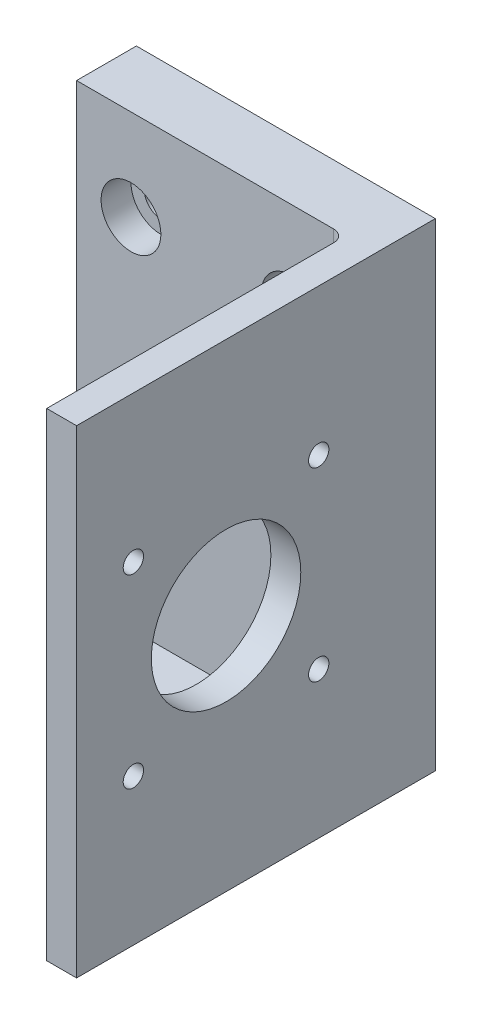
ISO-10303-21;
HEADER;
FILE_DESCRIPTION(('STEP AP214'),'2;1');
FILE_NAME('part.step','',(''),(''),'','','');
FILE_SCHEMA(('AUTOMOTIVE_DESIGN { 1 0 10303 214 1 1 1 1 }'));
ENDSEC;
DATA;
#1=APPLICATION_CONTEXT('core data for automotive mechanical design processes');
#2=APPLICATION_PROTOCOL_DEFINITION('international standard','automotive_design',2000,#1);
#3=PRODUCT_CONTEXT('',#1,'mechanical');
#4=PRODUCT('Part','Part','',(#3));
#5=PRODUCT_RELATED_PRODUCT_CATEGORY('part','',(#4));
#6=PRODUCT_DEFINITION_FORMATION('','',#4);
#7=PRODUCT_DEFINITION_CONTEXT('part definition',#1,'design');
#8=PRODUCT_DEFINITION('design','',#6,#7);
#9=PRODUCT_DEFINITION_SHAPE('','',#8);
#10=(LENGTH_UNIT() NAMED_UNIT(*) SI_UNIT(.MILLI.,.METRE.));
#11=(NAMED_UNIT(*) PLANE_ANGLE_UNIT() SI_UNIT($,.RADIAN.));
#12=(NAMED_UNIT(*) SI_UNIT($,.STERADIAN.) SOLID_ANGLE_UNIT());
#13=UNCERTAINTY_MEASURE_WITH_UNIT(LENGTH_MEASURE(1.E-05),#10,'distance_accuracy_value','');
#14=(GEOMETRIC_REPRESENTATION_CONTEXT(3) GLOBAL_UNCERTAINTY_ASSIGNED_CONTEXT((#13)) GLOBAL_UNIT_ASSIGNED_CONTEXT((#10,
#11,#12)) REPRESENTATION_CONTEXT('',''));
#15=CARTESIAN_POINT('',(0.,0.,0.));
#16=DIRECTION('',(0.,0.,1.));
#17=DIRECTION('',(1.,0.,0.));
#18=AXIS2_PLACEMENT_3D('',#15,#16,#17);
#19=CARTESIAN_POINT('',(0.,0.,10.));
#20=DIRECTION('',(0.,0.,1.));
#21=DIRECTION('',(1.,0.,0.));
#22=AXIS2_PLACEMENT_3D('',#19,#20,#21);
#23=PLANE('',#22);
#24=CARTESIAN_POINT('',(10.9029313913286,24.76,10.));
#25=DIRECTION('',(0.,0.,1.));
#26=DIRECTION('',(1.,0.,0.));
#27=AXIS2_PLACEMENT_3D('',#24,#25,#26);
#28=CIRCLE('',#27,5.);
#29=CARTESIAN_POINT('',(15.9029313913286,24.76,10.));
#30=VERTEX_POINT('',#29);
#31=EDGE_CURVE('E267',#30,#30,#28,.T.);
#32=ORIENTED_EDGE('',*,*,#31,.F.);
#33=EDGE_LOOP('',(#32));
#34=FACE_BOUND('',#33,.T.);
#35=CARTESIAN_POINT('',(-15.9029313913286,-24.76,10.));
#36=DIRECTION('',(0.,0.,1.));
#37=DIRECTION('',(1.,0.,0.));
#38=AXIS2_PLACEMENT_3D('',#35,#36,#37);
#39=CIRCLE('',#38,5.);
#40=CARTESIAN_POINT('',(-10.9029313913286,-24.76,10.));
#41=VERTEX_POINT('',#40);
#42=EDGE_CURVE('E284',#41,#41,#39,.T.);
#43=ORIENTED_EDGE('',*,*,#42,.F.);
#44=EDGE_LOOP('',(#43));
#45=FACE_BOUND('',#44,.T.);
#46=CARTESIAN_POINT('',(10.9029313913286,-24.76,10.));
#47=DIRECTION('',(0.,0.,1.));
#48=DIRECTION('',(1.,0.,0.));
#49=AXIS2_PLACEMENT_3D('',#46,#47,#48);
#50=CIRCLE('',#49,5.);
#51=CARTESIAN_POINT('',(15.9029313913286,-24.76,10.));
#52=VERTEX_POINT('',#51);
#53=EDGE_CURVE('E300',#52,#52,#50,.T.);
#54=ORIENTED_EDGE('',*,*,#53,.F.);
#55=EDGE_LOOP('',(#54));
#56=FACE_BOUND('',#55,.T.);
#57=CARTESIAN_POINT('',(-15.9029313913286,24.76,10.));
#58=DIRECTION('',(0.,0.,1.));
#59=DIRECTION('',(1.,0.,0.));
#60=AXIS2_PLACEMENT_3D('',#57,#58,#59);
#61=CIRCLE('',#60,5.);
#62=CARTESIAN_POINT('',(-10.9029313913286,24.76,10.));
#63=VERTEX_POINT('',#62);
#64=EDGE_CURVE('E316',#63,#63,#61,.T.);
#65=ORIENTED_EDGE('',*,*,#64,.F.);
#66=EDGE_LOOP('',(#65));
#67=FACE_BOUND('',#66,.T.);
#68=DIRECTION('',(0.,-1.,0.));
#69=VECTOR('',#68,1.);
#70=CARTESIAN_POINT('',(-25.,-40.,10.));
#71=LINE('',#70,#69);
#72=CARTESIAN_POINT('',(-25.,40.,10.));
#73=VERTEX_POINT('',#72);
#74=CARTESIAN_POINT('',(-25.,-34.92,10.));
#75=VERTEX_POINT('',#74);
#76=EDGE_CURVE('E162',#73,#75,#71,.T.);
#77=ORIENTED_EDGE('',*,*,#76,.T.);
#78=DIRECTION('',(1.,0.,0.));
#79=VECTOR('',#78,1.);
#80=CARTESIAN_POINT('',(-25.,-34.92,10.));
#81=LINE('',#80,#79);
#82=CARTESIAN_POINT('',(18.,-34.92,10.));
#83=VERTEX_POINT('',#82);
#84=EDGE_CURVE('E125',#75,#83,#81,.T.);
#85=ORIENTED_EDGE('',*,*,#84,.T.);
#86=DIRECTION('',(0.,-1.,0.));
#87=VECTOR('',#86,1.);
#88=CARTESIAN_POINT('',(18.,0.,10.));
#89=LINE('',#88,#87);
#90=CARTESIAN_POINT('',(18.,40.,10.));
#91=VERTEX_POINT('',#90);
#92=EDGE_CURVE('E63',#83,#91,#89,.F.);
#93=ORIENTED_EDGE('',*,*,#92,.T.);
#94=DIRECTION('',(-1.,0.,0.));
#95=VECTOR('',#94,1.);
#96=CARTESIAN_POINT('',(25.,40.,10.));
#97=LINE('',#96,#95);
#98=EDGE_CURVE('E166',#91,#73,#97,.T.);
#99=ORIENTED_EDGE('',*,*,#98,.T.);
#100=EDGE_LOOP('',(#77,#85,#93,#99));
#101=FACE_BOUND('',#100,.T.);
#102=ADVANCED_FACE('F47',(#34,#45,#56,#67,#101),#23,.T.);
#103=CARTESIAN_POINT('',(20.,40.,60.));
#104=DIRECTION('',(1.,0.,0.));
#105=DIRECTION('',(0.,1.,0.));
#106=AXIS2_PLACEMENT_3D('',#103,#104,#105);
#107=PLANE('',#106);
#108=CARTESIAN_POINT('',(20.,0.,35.));
#109=DIRECTION('',(1.,0.,0.));
#110=DIRECTION('',(0.,1.,0.));
#111=AXIS2_PLACEMENT_3D('',#108,#109,#110);
#112=CIRCLE('',#111,12.5);
#113=CARTESIAN_POINT('',(20.,12.5,35.));
#114=VERTEX_POINT('',#113);
#115=EDGE_CURVE('E197',#114,#114,#112,.T.);
#116=ORIENTED_EDGE('',*,*,#115,.T.);
#117=EDGE_LOOP('',(#116));
#118=FACE_BOUND('',#117,.T.);
#119=CARTESIAN_POINT('',(20.,-15.5,50.5));
#120=DIRECTION('',(1.,0.,0.));
#121=DIRECTION('',(0.,1.,0.));
#122=AXIS2_PLACEMENT_3D('',#119,#120,#121);
#123=CIRCLE('',#122,1.7);
#124=CARTESIAN_POINT('',(20.,-13.8,50.5));
#125=VERTEX_POINT('',#124);
#126=EDGE_CURVE('E202',#125,#125,#123,.T.);
#127=ORIENTED_EDGE('',*,*,#126,.T.);
#128=EDGE_LOOP('',(#127));
#129=FACE_BOUND('',#128,.T.);
#130=CARTESIAN_POINT('',(20.,15.5,19.5));
#131=DIRECTION('',(1.,0.,0.));
#132=DIRECTION('',(0.,1.,0.));
#133=AXIS2_PLACEMENT_3D('',#130,#131,#132);
#134=CIRCLE('',#133,1.7);
#135=CARTESIAN_POINT('',(20.,17.2,19.5));
#136=VERTEX_POINT('',#135);
#137=EDGE_CURVE('E207',#136,#136,#134,.T.);
#138=ORIENTED_EDGE('',*,*,#137,.T.);
#139=EDGE_LOOP('',(#138));
#140=FACE_BOUND('',#139,.T.);
#141=CARTESIAN_POINT('',(20.,-15.5,19.5));
#142=DIRECTION('',(1.,0.,0.));
#143=DIRECTION('',(0.,1.,0.));
#144=AXIS2_PLACEMENT_3D('',#141,#142,#143);
#145=CIRCLE('',#144,1.7);
#146=CARTESIAN_POINT('',(20.,-13.8,19.5));
#147=VERTEX_POINT('',#146);
#148=EDGE_CURVE('E212',#147,#147,#145,.T.);
#149=ORIENTED_EDGE('',*,*,#148,.T.);
#150=EDGE_LOOP('',(#149));
#151=FACE_BOUND('',#150,.T.);
#152=CARTESIAN_POINT('',(20.,15.5,50.5));
#153=DIRECTION('',(1.,0.,0.));
#154=DIRECTION('',(0.,1.,0.));
#155=AXIS2_PLACEMENT_3D('',#152,#153,#154);
#156=CIRCLE('',#155,1.7);
#157=CARTESIAN_POINT('',(20.,17.2,50.5));
#158=VERTEX_POINT('',#157);
#159=EDGE_CURVE('E217',#158,#158,#156,.T.);
#160=ORIENTED_EDGE('',*,*,#159,.T.);
#161=EDGE_LOOP('',(#160));
#162=FACE_BOUND('',#161,.T.);
#163=DIRECTION('',(0.,0.,1.));
#164=VECTOR('',#163,1.);
#165=CARTESIAN_POINT('',(20.,-34.92,60.));
#166=LINE('',#165,#164);
#167=CARTESIAN_POINT('',(20.,-34.92,12.));
#168=VERTEX_POINT('',#167);
#169=CARTESIAN_POINT('',(20.,-34.92,60.));
#170=VERTEX_POINT('',#169);
#171=EDGE_CURVE('E130',#168,#170,#166,.T.);
#172=ORIENTED_EDGE('',*,*,#171,.T.);
#173=DIRECTION('',(0.,-1.,0.));
#174=VECTOR('',#173,1.);
#175=CARTESIAN_POINT('',(20.,40.,60.));
#176=LINE('',#175,#174);
#177=CARTESIAN_POINT('',(20.,40.,60.));
#178=VERTEX_POINT('',#177);
#179=EDGE_CURVE('E139',#178,#170,#176,.T.);
#180=ORIENTED_EDGE('',*,*,#179,.F.);
#181=DIRECTION('',(0.,0.,-1.));
#182=VECTOR('',#181,1.);
#183=CARTESIAN_POINT('',(20.,40.,60.));
#184=LINE('',#183,#182);
#185=CARTESIAN_POINT('',(20.,40.,12.));
#186=VERTEX_POINT('',#185);
#187=EDGE_CURVE('E153',#178,#186,#184,.T.);
#188=ORIENTED_EDGE('',*,*,#187,.T.);
#189=DIRECTION('',(0.,-1.,0.));
#190=VECTOR('',#189,1.);
#191=CARTESIAN_POINT('',(20.,40.,12.));
#192=LINE('',#191,#190);
#193=EDGE_CURVE('E141',#186,#168,#192,.T.);
#194=ORIENTED_EDGE('',*,*,#193,.T.);
#195=EDGE_LOOP('',(#172,#180,#188,#194));
#196=FACE_BOUND('',#195,.T.);
#197=ADVANCED_FACE('F138',(#118,#129,#140,#151,#162,#196),#107,.F.);
#198=CARTESIAN_POINT('',(18.,40.,12.));
#199=DIRECTION('',(0.,-1.,0.));
#200=DIRECTION('',(1.,0.,0.));
#201=AXIS2_PLACEMENT_3D('',#198,#199,#200);
#202=CYLINDRICAL_SURFACE('',#201,2.);
#203=CARTESIAN_POINT('',(18.,-34.92,12.));
#204=DIRECTION('',(0.,-1.,0.));
#205=DIRECTION('',(1.,0.,0.));
#206=AXIS2_PLACEMENT_3D('',#203,#204,#205);
#207=CIRCLE('',#206,2.);
#208=EDGE_CURVE('E11',#168,#83,#207,.F.);
#209=ORIENTED_EDGE('',*,*,#208,.F.);
#210=ORIENTED_EDGE('',*,*,#193,.F.);
#211=CARTESIAN_POINT('',(18.,40.,12.));
#212=DIRECTION('',(0.,-1.,0.));
#213=DIRECTION('',(0.,0.,-1.));
#214=AXIS2_PLACEMENT_3D('',#211,#212,#213);
#215=CIRCLE('',#214,2.);
#216=EDGE_CURVE('E56',#91,#186,#215,.T.);
#217=ORIENTED_EDGE('',*,*,#216,.F.);
#218=ORIENTED_EDGE('',*,*,#92,.F.);
#219=EDGE_LOOP('',(#209,#210,#217,#218));
#220=FACE_BOUND('',#219,.T.);
#221=ADVANCED_FACE('F49',(#220),#202,.F.);
#222=CARTESIAN_POINT('',(25.,-40.,10.));
#223=DIRECTION('',(-1.,0.,0.));
#224=DIRECTION('',(0.,0.,1.));
#225=AXIS2_PLACEMENT_3D('',#222,#223,#224);
#226=PLANE('',#225);
#227=CARTESIAN_POINT('',(25.,15.5,50.5));
#228=DIRECTION('',(1.,0.,0.));
#229=DIRECTION('',(0.,0.,-1.));
#230=AXIS2_PLACEMENT_3D('',#227,#228,#229);
#231=CIRCLE('',#230,1.7);
#232=CARTESIAN_POINT('',(25.,15.5,48.8));
#233=VERTEX_POINT('',#232);
#234=EDGE_CURVE('E221',#233,#233,#231,.T.);
#235=ORIENTED_EDGE('',*,*,#234,.F.);
#236=EDGE_LOOP('',(#235));
#237=FACE_BOUND('',#236,.T.);
#238=CARTESIAN_POINT('',(25.,-15.5,19.5));
#239=DIRECTION('',(1.,0.,0.));
#240=DIRECTION('',(0.,0.,-1.));
#241=AXIS2_PLACEMENT_3D('',#238,#239,#240);
#242=CIRCLE('',#241,1.7);
#243=CARTESIAN_POINT('',(25.,-15.5,17.8));
#244=VERTEX_POINT('',#243);
#245=EDGE_CURVE('E216',#244,#244,#242,.T.);
#246=ORIENTED_EDGE('',*,*,#245,.F.);
#247=EDGE_LOOP('',(#246));
#248=FACE_BOUND('',#247,.T.);
#249=CARTESIAN_POINT('',(25.,15.5,19.5));
#250=DIRECTION('',(1.,0.,0.));
#251=DIRECTION('',(0.,0.,-1.));
#252=AXIS2_PLACEMENT_3D('',#249,#250,#251);
#253=CIRCLE('',#252,1.7);
#254=CARTESIAN_POINT('',(25.,15.5,17.8));
#255=VERTEX_POINT('',#254);
#256=EDGE_CURVE('E211',#255,#255,#253,.T.);
#257=ORIENTED_EDGE('',*,*,#256,.F.);
#258=EDGE_LOOP('',(#257));
#259=FACE_BOUND('',#258,.T.);
#260=CARTESIAN_POINT('',(25.,0.,35.));
#261=DIRECTION('',(1.,0.,0.));
#262=DIRECTION('',(0.,0.,-1.));
#263=AXIS2_PLACEMENT_3D('',#260,#261,#262);
#264=CIRCLE('',#263,12.5);
#265=CARTESIAN_POINT('',(25.,0.,22.5));
#266=VERTEX_POINT('',#265);
#267=EDGE_CURVE('E201',#266,#266,#264,.T.);
#268=ORIENTED_EDGE('',*,*,#267,.F.);
#269=EDGE_LOOP('',(#268));
#270=FACE_BOUND('',#269,.T.);
#271=DIRECTION('',(0.,1.,0.));
#272=VECTOR('',#271,1.);
#273=CARTESIAN_POINT('',(25.,-40.,0.));
#274=LINE('',#273,#272);
#275=CARTESIAN_POINT('',(25.,-40.,0.));
#276=VERTEX_POINT('',#275);
#277=CARTESIAN_POINT('',(25.,40.,0.));
#278=VERTEX_POINT('',#277);
#279=EDGE_CURVE('E177',#276,#278,#274,.T.);
#280=ORIENTED_EDGE('',*,*,#279,.T.);
#281=DIRECTION('',(0.,0.,-1.));
#282=VECTOR('',#281,1.);
#283=CARTESIAN_POINT('',(25.,40.,10.));
#284=LINE('',#283,#282);
#285=CARTESIAN_POINT('',(25.,40.,60.));
#286=VERTEX_POINT('',#285);
#287=EDGE_CURVE('E185',#286,#278,#284,.T.);
#288=ORIENTED_EDGE('',*,*,#287,.F.);
#289=DIRECTION('',(0.,1.,0.));
#290=VECTOR('',#289,1.);
#291=CARTESIAN_POINT('',(25.,40.,60.));
#292=LINE('',#291,#290);
#293=CARTESIAN_POINT('',(25.,-40.,60.));
#294=VERTEX_POINT('',#293);
#295=EDGE_CURVE('E155',#294,#286,#292,.T.);
#296=ORIENTED_EDGE('',*,*,#295,.F.);
#297=DIRECTION('',(0.,0.,-1.));
#298=VECTOR('',#297,1.);
#299=CARTESIAN_POINT('',(25.,-40.,10.));
#300=LINE('',#299,#298);
#301=EDGE_CURVE('E189',#294,#276,#300,.T.);
#302=ORIENTED_EDGE('',*,*,#301,.T.);
#303=EDGE_LOOP('',(#280,#288,#296,#302));
#304=FACE_BOUND('',#303,.T.);
#305=CARTESIAN_POINT('',(25.,-15.5,50.5));
#306=DIRECTION('',(1.,0.,0.));
#307=DIRECTION('',(0.,0.,-1.));
#308=AXIS2_PLACEMENT_3D('',#305,#306,#307);
#309=CIRCLE('',#308,1.7);
#310=CARTESIAN_POINT('',(25.,-15.5,48.8));
#311=VERTEX_POINT('',#310);
#312=EDGE_CURVE('E206',#311,#311,#309,.T.);
#313=ORIENTED_EDGE('',*,*,#312,.F.);
#314=EDGE_LOOP('',(#313));
#315=FACE_BOUND('',#314,.T.);
#316=ADVANCED_FACE('F254',(#237,#248,#259,#270,#304,#315),#226,.F.);
#317=CARTESIAN_POINT('',(-25.,-40.,10.));
#318=DIRECTION('',(1.,0.,0.));
#319=DIRECTION('',(0.,0.,-1.));
#320=AXIS2_PLACEMENT_3D('',#317,#318,#319);
#321=PLANE('',#320);
#322=DIRECTION('',(0.,-1.,0.));
#323=VECTOR('',#322,1.);
#324=CARTESIAN_POINT('',(-25.,-40.,0.));
#325=LINE('',#324,#323);
#326=CARTESIAN_POINT('',(-25.,40.,0.));
#327=VERTEX_POINT('',#326);
#328=CARTESIAN_POINT('',(-25.,-40.,0.));
#329=VERTEX_POINT('',#328);
#330=EDGE_CURVE('E161',#327,#329,#325,.T.);
#331=ORIENTED_EDGE('',*,*,#330,.T.);
#332=DIRECTION('',(0.,0.,-1.));
#333=VECTOR('',#332,1.);
#334=CARTESIAN_POINT('',(-25.,-40.,10.));
#335=LINE('',#334,#333);
#336=CARTESIAN_POINT('',(-25.,-40.,10.));
#337=VERTEX_POINT('',#336);
#338=EDGE_CURVE('E193',#337,#329,#335,.T.);
#339=ORIENTED_EDGE('',*,*,#338,.F.);
#340=DIRECTION('',(0.,-1.,0.));
#341=VECTOR('',#340,1.);
#342=CARTESIAN_POINT('',(-25.,-34.92,10.));
#343=LINE('',#342,#341);
#344=EDGE_CURVE('E124',#75,#337,#343,.T.);
#345=ORIENTED_EDGE('',*,*,#344,.F.);
#346=ORIENTED_EDGE('',*,*,#76,.F.);
#347=DIRECTION('',(0.,0.,-1.));
#348=VECTOR('',#347,1.);
#349=CARTESIAN_POINT('',(-25.,40.,10.));
#350=LINE('',#349,#348);
#351=EDGE_CURVE('E170',#73,#327,#350,.T.);
#352=ORIENTED_EDGE('',*,*,#351,.T.);
#353=EDGE_LOOP('',(#331,#339,#345,#346,#352));
#354=FACE_BOUND('',#353,.T.);
#355=ADVANCED_FACE('F363',(#354),#321,.F.);
#356=CARTESIAN_POINT('',(25.,-40.,10.));
#357=DIRECTION('',(0.,1.,0.));
#358=DIRECTION('',(-1.,0.,0.));
#359=AXIS2_PLACEMENT_3D('',#356,#357,#358);
#360=PLANE('',#359);
#361=DIRECTION('',(1.,0.,0.));
#362=VECTOR('',#361,1.);
#363=CARTESIAN_POINT('',(25.,-40.,60.));
#364=LINE('',#363,#362);
#365=CARTESIAN_POINT('',(20.,-40.,60.));
#366=VERTEX_POINT('',#365);
#367=EDGE_CURVE('E149',#366,#294,#364,.T.);
#368=ORIENTED_EDGE('',*,*,#367,.F.);
#369=DIRECTION('',(-0.66896473162245,0.,-0.743294146247166));
#370=VECTOR('',#369,1.);
#371=CARTESIAN_POINT('',(20.,-40.,60.));
#372=LINE('',#371,#370);
#373=EDGE_CURVE('E118',#366,#337,#372,.T.);
#374=ORIENTED_EDGE('',*,*,#373,.T.);
#375=ORIENTED_EDGE('',*,*,#338,.T.);
#376=DIRECTION('',(1.,0.,0.));
#377=VECTOR('',#376,1.);
#378=CARTESIAN_POINT('',(25.,-40.,0.));
#379=LINE('',#378,#377);
#380=EDGE_CURVE('E174',#329,#276,#379,.T.);
#381=ORIENTED_EDGE('',*,*,#380,.T.);
#382=ORIENTED_EDGE('',*,*,#301,.F.);
#383=EDGE_LOOP('',(#368,#374,#375,#381,#382));
#384=FACE_BOUND('',#383,.T.);
#385=ADVANCED_FACE('F360',(#384),#360,.F.);
#386=CARTESIAN_POINT('',(25.,40.,10.));
#387=DIRECTION('',(0.,-1.,0.));
#388=DIRECTION('',(0.,0.,-1.));
#389=AXIS2_PLACEMENT_3D('',#386,#387,#388);
#390=PLANE('',#389);
#391=DIRECTION('',(-1.,0.,0.));
#392=VECTOR('',#391,1.);
#393=CARTESIAN_POINT('',(25.,40.,0.));
#394=LINE('',#393,#392);
#395=EDGE_CURVE('E167',#278,#327,#394,.T.);
#396=ORIENTED_EDGE('',*,*,#395,.T.);
#397=ORIENTED_EDGE('',*,*,#351,.F.);
#398=ORIENTED_EDGE('',*,*,#98,.F.);
#399=ORIENTED_EDGE('',*,*,#216,.T.);
#400=ORIENTED_EDGE('',*,*,#187,.F.);
#401=DIRECTION('',(-1.,0.,0.));
#402=VECTOR('',#401,1.);
#403=CARTESIAN_POINT('',(25.,40.,60.));
#404=LINE('',#403,#402);
#405=EDGE_CURVE('E147',#286,#178,#404,.T.);
#406=ORIENTED_EDGE('',*,*,#405,.F.);
#407=ORIENTED_EDGE('',*,*,#287,.T.);
#408=EDGE_LOOP('',(#396,#397,#398,#399,#400,#406,#407));
#409=FACE_BOUND('',#408,.T.);
#410=ADVANCED_FACE('F258',(#409),#390,.F.);
#411=CARTESIAN_POINT('',(0.,0.,0.));
#412=DIRECTION('',(0.,0.,1.));
#413=DIRECTION('',(1.,0.,0.));
#414=AXIS2_PLACEMENT_3D('',#411,#412,#413);
#415=PLANE('',#414);
#416=CARTESIAN_POINT('',(10.9029313913286,24.76,0.));
#417=DIRECTION('',(0.,0.,1.));
#418=DIRECTION('',(1.,0.,0.));
#419=AXIS2_PLACEMENT_3D('',#416,#417,#418);
#420=CIRCLE('',#419,2.75);
#421=CARTESIAN_POINT('',(13.6529313913286,24.76,0.));
#422=VERTEX_POINT('',#421);
#423=EDGE_CURVE('E280',#422,#422,#420,.T.);
#424=ORIENTED_EDGE('',*,*,#423,.T.);
#425=EDGE_LOOP('',(#424));
#426=FACE_BOUND('',#425,.T.);
#427=CARTESIAN_POINT('',(-15.9029313913286,-24.76,0.));
#428=DIRECTION('',(0.,0.,1.));
#429=DIRECTION('',(1.,0.,0.));
#430=AXIS2_PLACEMENT_3D('',#427,#428,#429);
#431=CIRCLE('',#430,2.75);
#432=CARTESIAN_POINT('',(-13.1529313913286,-24.76,0.));
#433=VERTEX_POINT('',#432);
#434=EDGE_CURVE('E296',#433,#433,#431,.T.);
#435=ORIENTED_EDGE('',*,*,#434,.T.);
#436=EDGE_LOOP('',(#435));
#437=FACE_BOUND('',#436,.T.);
#438=CARTESIAN_POINT('',(10.9029313913286,-24.76,0.));
#439=DIRECTION('',(0.,0.,1.));
#440=DIRECTION('',(1.,0.,0.));
#441=AXIS2_PLACEMENT_3D('',#438,#439,#440);
#442=CIRCLE('',#441,2.75);
#443=CARTESIAN_POINT('',(13.6529313913286,-24.76,0.));
#444=VERTEX_POINT('',#443);
#445=EDGE_CURVE('E312',#444,#444,#442,.T.);
#446=ORIENTED_EDGE('',*,*,#445,.T.);
#447=EDGE_LOOP('',(#446));
#448=FACE_BOUND('',#447,.T.);
#449=CARTESIAN_POINT('',(-15.9029313913286,24.76,0.));
#450=DIRECTION('',(0.,0.,1.));
#451=DIRECTION('',(1.,0.,0.));
#452=AXIS2_PLACEMENT_3D('',#449,#450,#451);
#453=CIRCLE('',#452,2.75);
#454=CARTESIAN_POINT('',(-13.1529313913286,24.76,0.));
#455=VERTEX_POINT('',#454);
#456=EDGE_CURVE('E233',#455,#455,#453,.T.);
#457=ORIENTED_EDGE('',*,*,#456,.T.);
#458=EDGE_LOOP('',(#457));
#459=FACE_BOUND('',#458,.T.);
#460=ORIENTED_EDGE('',*,*,#330,.F.);
#461=ORIENTED_EDGE('',*,*,#395,.F.);
#462=ORIENTED_EDGE('',*,*,#279,.F.);
#463=ORIENTED_EDGE('',*,*,#380,.F.);
#464=EDGE_LOOP('',(#460,#461,#462,#463));
#465=FACE_BOUND('',#464,.T.);
#466=ADVANCED_FACE('F355',(#426,#437,#448,#459,#465),#415,.F.);
#467=CARTESIAN_POINT('',(0.,0.,60.));
#468=DIRECTION('',(0.,0.,-1.));
#469=DIRECTION('',(-1.,0.,0.));
#470=AXIS2_PLACEMENT_3D('',#467,#468,#469);
#471=PLANE('',#470);
#472=ORIENTED_EDGE('',*,*,#295,.T.);
#473=ORIENTED_EDGE('',*,*,#405,.T.);
#474=ORIENTED_EDGE('',*,*,#179,.T.);
#475=DIRECTION('',(0.,-1.,0.));
#476=VECTOR('',#475,1.);
#477=CARTESIAN_POINT('',(20.,-34.92,60.));
#478=LINE('',#477,#476);
#479=EDGE_CURVE('E112',#170,#366,#478,.T.);
#480=ORIENTED_EDGE('',*,*,#479,.T.);
#481=ORIENTED_EDGE('',*,*,#367,.T.);
#482=EDGE_LOOP('',(#472,#473,#474,#480,#481));
#483=FACE_BOUND('',#482,.T.);
#484=ADVANCED_FACE('F145',(#483),#471,.F.);
#485=CARTESIAN_POINT('',(-25.,0.,35.));
#486=DIRECTION('',(1.,0.,0.));
#487=DIRECTION('',(0.,0.,-1.));
#488=AXIS2_PLACEMENT_3D('',#485,#486,#487);
#489=CYLINDRICAL_SURFACE('',#488,12.5);
#490=ORIENTED_EDGE('',*,*,#267,.T.);
#491=EDGE_LOOP('',(#490));
#492=FACE_BOUND('',#491,.T.);
#493=ORIENTED_EDGE('',*,*,#115,.F.);
#494=EDGE_LOOP('',(#493));
#495=FACE_BOUND('',#494,.T.);
#496=ADVANCED_FACE('F393',(#492,#495),#489,.F.);
#497=CARTESIAN_POINT('',(25.,-15.5,50.5));
#498=DIRECTION('',(1.,0.,0.));
#499=DIRECTION('',(0.,0.,-1.));
#500=AXIS2_PLACEMENT_3D('',#497,#498,#499);
#501=CYLINDRICAL_SURFACE('',#500,1.7);
#502=ORIENTED_EDGE('',*,*,#312,.T.);
#503=EDGE_LOOP('',(#502));
#504=FACE_BOUND('',#503,.T.);
#505=ORIENTED_EDGE('',*,*,#126,.F.);
#506=EDGE_LOOP('',(#505));
#507=FACE_BOUND('',#506,.T.);
#508=ADVANCED_FACE('F547',(#504,#507),#501,.F.);
#509=CARTESIAN_POINT('',(25.,15.5,19.5));
#510=DIRECTION('',(1.,0.,0.));
#511=DIRECTION('',(0.,0.,-1.));
#512=AXIS2_PLACEMENT_3D('',#509,#510,#511);
#513=CYLINDRICAL_SURFACE('',#512,1.7);
#514=ORIENTED_EDGE('',*,*,#256,.T.);
#515=EDGE_LOOP('',(#514));
#516=FACE_BOUND('',#515,.T.);
#517=ORIENTED_EDGE('',*,*,#137,.F.);
#518=EDGE_LOOP('',(#517));
#519=FACE_BOUND('',#518,.T.);
#520=ADVANCED_FACE('F538',(#516,#519),#513,.F.);
#521=CARTESIAN_POINT('',(25.,-15.5,19.5));
#522=DIRECTION('',(1.,0.,0.));
#523=DIRECTION('',(0.,0.,-1.));
#524=AXIS2_PLACEMENT_3D('',#521,#522,#523);
#525=CYLINDRICAL_SURFACE('',#524,1.7);
#526=ORIENTED_EDGE('',*,*,#245,.T.);
#527=EDGE_LOOP('',(#526));
#528=FACE_BOUND('',#527,.T.);
#529=ORIENTED_EDGE('',*,*,#148,.F.);
#530=EDGE_LOOP('',(#529));
#531=FACE_BOUND('',#530,.T.);
#532=ADVANCED_FACE('F530',(#528,#531),#525,.F.);
#533=CARTESIAN_POINT('',(25.,15.5,50.5));
#534=DIRECTION('',(1.,0.,0.));
#535=DIRECTION('',(0.,0.,-1.));
#536=AXIS2_PLACEMENT_3D('',#533,#534,#535);
#537=CYLINDRICAL_SURFACE('',#536,1.7);
#538=ORIENTED_EDGE('',*,*,#234,.T.);
#539=EDGE_LOOP('',(#538));
#540=FACE_BOUND('',#539,.T.);
#541=ORIENTED_EDGE('',*,*,#159,.F.);
#542=EDGE_LOOP('',(#541));
#543=FACE_BOUND('',#542,.T.);
#544=ADVANCED_FACE('F521',(#540,#543),#537,.F.);
#545=CARTESIAN_POINT('',(-15.9029313913286,24.76,10.));
#546=DIRECTION('',(0.,0.,1.));
#547=DIRECTION('',(1.,0.,0.));
#548=AXIS2_PLACEMENT_3D('',#545,#546,#547);
#549=CYLINDRICAL_SURFACE('',#548,2.75);
#550=ORIENTED_EDGE('',*,*,#456,.F.);
#551=EDGE_LOOP('',(#550));
#552=FACE_BOUND('',#551,.T.);
#553=CARTESIAN_POINT('',(-15.9029313913286,24.76,5.));
#554=DIRECTION('',(0.,0.,1.));
#555=DIRECTION('',(1.,0.,0.));
#556=AXIS2_PLACEMENT_3D('',#553,#554,#555);
#557=CIRCLE('',#556,2.75);
#558=CARTESIAN_POINT('',(-13.1529313913286,24.76,5.));
#559=VERTEX_POINT('',#558);
#560=EDGE_CURVE('E239',#559,#559,#557,.T.);
#561=ORIENTED_EDGE('',*,*,#560,.T.);
#562=EDGE_LOOP('',(#561));
#563=FACE_BOUND('',#562,.T.);
#564=ADVANCED_FACE('F327',(#552,#563),#549,.F.);
#565=CARTESIAN_POINT('',(-13.1529313913286,24.76,5.));
#566=DIRECTION('',(0.,0.,-1.));
#567=DIRECTION('',(-1.,0.,0.));
#568=AXIS2_PLACEMENT_3D('',#565,#566,#567);
#569=PLANE('',#568);
#570=ORIENTED_EDGE('',*,*,#560,.F.);
#571=EDGE_LOOP('',(#570));
#572=FACE_BOUND('',#571,.T.);
#573=CARTESIAN_POINT('',(-15.9029313913286,24.76,5.));
#574=DIRECTION('',(0.,0.,1.));
#575=DIRECTION('',(1.,0.,0.));
#576=AXIS2_PLACEMENT_3D('',#573,#574,#575);
#577=CIRCLE('',#576,5.);
#578=CARTESIAN_POINT('',(-10.9029313913286,24.76,5.));
#579=VERTEX_POINT('',#578);
#580=EDGE_CURVE('E320',#579,#579,#577,.T.);
#581=ORIENTED_EDGE('',*,*,#580,.T.);
#582=EDGE_LOOP('',(#581));
#583=FACE_BOUND('',#582,.T.);
#584=ADVANCED_FACE('F329',(#572,#583),#569,.F.);
#585=CARTESIAN_POINT('',(-15.9029313913286,24.76,10.));
#586=DIRECTION('',(0.,0.,1.));
#587=DIRECTION('',(1.,0.,0.));
#588=AXIS2_PLACEMENT_3D('',#585,#586,#587);
#589=CYLINDRICAL_SURFACE('',#588,5.);
#590=ORIENTED_EDGE('',*,*,#580,.F.);
#591=EDGE_LOOP('',(#590));
#592=FACE_BOUND('',#591,.T.);
#593=ORIENTED_EDGE('',*,*,#64,.T.);
#594=EDGE_LOOP('',(#593));
#595=FACE_BOUND('',#594,.T.);
#596=ADVANCED_FACE('F332',(#592,#595),#589,.F.);
#597=CARTESIAN_POINT('',(10.9029313913286,-24.76,10.));
#598=DIRECTION('',(0.,0.,1.));
#599=DIRECTION('',(1.,0.,0.));
#600=AXIS2_PLACEMENT_3D('',#597,#598,#599);
#601=CYLINDRICAL_SURFACE('',#600,2.75);
#602=ORIENTED_EDGE('',*,*,#445,.F.);
#603=EDGE_LOOP('',(#602));
#604=FACE_BOUND('',#603,.T.);
#605=CARTESIAN_POINT('',(10.9029313913286,-24.76,5.));
#606=DIRECTION('',(0.,0.,1.));
#607=DIRECTION('',(1.,0.,0.));
#608=AXIS2_PLACEMENT_3D('',#605,#606,#607);
#609=CIRCLE('',#608,2.75);
#610=CARTESIAN_POINT('',(13.6529313913286,-24.76,5.));
#611=VERTEX_POINT('',#610);
#612=EDGE_CURVE('E308',#611,#611,#609,.T.);
#613=ORIENTED_EDGE('',*,*,#612,.T.);
#614=EDGE_LOOP('',(#613));
#615=FACE_BOUND('',#614,.T.);
#616=ADVANCED_FACE('F338',(#604,#615),#601,.F.);
#617=CARTESIAN_POINT('',(13.6529313913286,-24.76,5.));
#618=DIRECTION('',(0.,0.,-1.));
#619=DIRECTION('',(-1.,0.,0.));
#620=AXIS2_PLACEMENT_3D('',#617,#618,#619);
#621=PLANE('',#620);
#622=ORIENTED_EDGE('',*,*,#612,.F.);
#623=EDGE_LOOP('',(#622));
#624=FACE_BOUND('',#623,.T.);
#625=CARTESIAN_POINT('',(10.9029313913286,-24.76,5.));
#626=DIRECTION('',(0.,0.,1.));
#627=DIRECTION('',(1.,0.,0.));
#628=AXIS2_PLACEMENT_3D('',#625,#626,#627);
#629=CIRCLE('',#628,5.);
#630=CARTESIAN_POINT('',(15.9029313913286,-24.76,5.));
#631=VERTEX_POINT('',#630);
#632=EDGE_CURVE('E304',#631,#631,#629,.T.);
#633=ORIENTED_EDGE('',*,*,#632,.T.);
#634=EDGE_LOOP('',(#633));
#635=FACE_BOUND('',#634,.T.);
#636=ADVANCED_FACE('F486',(#624,#635),#621,.F.);
#637=CARTESIAN_POINT('',(10.9029313913286,-24.76,10.));
#638=DIRECTION('',(0.,0.,1.));
#639=DIRECTION('',(1.,0.,0.));
#640=AXIS2_PLACEMENT_3D('',#637,#638,#639);
#641=CYLINDRICAL_SURFACE('',#640,5.);
#642=ORIENTED_EDGE('',*,*,#632,.F.);
#643=EDGE_LOOP('',(#642));
#644=FACE_BOUND('',#643,.T.);
#645=ORIENTED_EDGE('',*,*,#53,.T.);
#646=EDGE_LOOP('',(#645));
#647=FACE_BOUND('',#646,.T.);
#648=ADVANCED_FACE('F477',(#644,#647),#641,.F.);
#649=CARTESIAN_POINT('',(-15.9029313913286,-24.76,10.));
#650=DIRECTION('',(0.,0.,1.));
#651=DIRECTION('',(1.,0.,0.));
#652=AXIS2_PLACEMENT_3D('',#649,#650,#651);
#653=CYLINDRICAL_SURFACE('',#652,2.75);
#654=ORIENTED_EDGE('',*,*,#434,.F.);
#655=EDGE_LOOP('',(#654));
#656=FACE_BOUND('',#655,.T.);
#657=CARTESIAN_POINT('',(-15.9029313913286,-24.76,5.));
#658=DIRECTION('',(0.,0.,1.));
#659=DIRECTION('',(1.,0.,0.));
#660=AXIS2_PLACEMENT_3D('',#657,#658,#659);
#661=CIRCLE('',#660,2.75);
#662=CARTESIAN_POINT('',(-13.1529313913286,-24.76,5.));
#663=VERTEX_POINT('',#662);
#664=EDGE_CURVE('E292',#663,#663,#661,.T.);
#665=ORIENTED_EDGE('',*,*,#664,.T.);
#666=EDGE_LOOP('',(#665));
#667=FACE_BOUND('',#666,.T.);
#668=ADVANCED_FACE('F468',(#656,#667),#653,.F.);
#669=CARTESIAN_POINT('',(-13.1529313913286,-24.76,5.));
#670=DIRECTION('',(0.,0.,-1.));
#671=DIRECTION('',(-1.,0.,0.));
#672=AXIS2_PLACEMENT_3D('',#669,#670,#671);
#673=PLANE('',#672);
#674=ORIENTED_EDGE('',*,*,#664,.F.);
#675=EDGE_LOOP('',(#674));
#676=FACE_BOUND('',#675,.T.);
#677=CARTESIAN_POINT('',(-15.9029313913286,-24.76,5.));
#678=DIRECTION('',(0.,0.,1.));
#679=DIRECTION('',(1.,0.,0.));
#680=AXIS2_PLACEMENT_3D('',#677,#678,#679);
#681=CIRCLE('',#680,5.);
#682=CARTESIAN_POINT('',(-10.9029313913286,-24.76,5.));
#683=VERTEX_POINT('',#682);
#684=EDGE_CURVE('E288',#683,#683,#681,.T.);
#685=ORIENTED_EDGE('',*,*,#684,.T.);
#686=EDGE_LOOP('',(#685));
#687=FACE_BOUND('',#686,.T.);
#688=ADVANCED_FACE('F459',(#676,#687),#673,.F.);
#689=CARTESIAN_POINT('',(-15.9029313913286,-24.76,10.));
#690=DIRECTION('',(0.,0.,1.));
#691=DIRECTION('',(1.,0.,0.));
#692=AXIS2_PLACEMENT_3D('',#689,#690,#691);
#693=CYLINDRICAL_SURFACE('',#692,5.);
#694=ORIENTED_EDGE('',*,*,#684,.F.);
#695=EDGE_LOOP('',(#694));
#696=FACE_BOUND('',#695,.T.);
#697=ORIENTED_EDGE('',*,*,#42,.T.);
#698=EDGE_LOOP('',(#697));
#699=FACE_BOUND('',#698,.T.);
#700=ADVANCED_FACE('F450',(#696,#699),#693,.F.);
#701=CARTESIAN_POINT('',(10.9029313913286,24.76,10.));
#702=DIRECTION('',(0.,0.,1.));
#703=DIRECTION('',(1.,0.,0.));
#704=AXIS2_PLACEMENT_3D('',#701,#702,#703);
#705=CYLINDRICAL_SURFACE('',#704,2.75);
#706=ORIENTED_EDGE('',*,*,#423,.F.);
#707=EDGE_LOOP('',(#706));
#708=FACE_BOUND('',#707,.T.);
#709=CARTESIAN_POINT('',(10.9029313913286,24.76,5.));
#710=DIRECTION('',(0.,0.,1.));
#711=DIRECTION('',(1.,0.,0.));
#712=AXIS2_PLACEMENT_3D('',#709,#710,#711);
#713=CIRCLE('',#712,2.75);
#714=CARTESIAN_POINT('',(13.6529313913286,24.76,5.));
#715=VERTEX_POINT('',#714);
#716=EDGE_CURVE('E276',#715,#715,#713,.T.);
#717=ORIENTED_EDGE('',*,*,#716,.T.);
#718=EDGE_LOOP('',(#717));
#719=FACE_BOUND('',#718,.T.);
#720=ADVANCED_FACE('F441',(#708,#719),#705,.F.);
#721=CARTESIAN_POINT('',(13.6529313913286,24.76,5.));
#722=DIRECTION('',(0.,0.,-1.));
#723=DIRECTION('',(-1.,0.,0.));
#724=AXIS2_PLACEMENT_3D('',#721,#722,#723);
#725=PLANE('',#724);
#726=ORIENTED_EDGE('',*,*,#716,.F.);
#727=EDGE_LOOP('',(#726));
#728=FACE_BOUND('',#727,.T.);
#729=CARTESIAN_POINT('',(10.9029313913286,24.76,5.));
#730=DIRECTION('',(0.,0.,1.));
#731=DIRECTION('',(1.,0.,0.));
#732=AXIS2_PLACEMENT_3D('',#729,#730,#731);
#733=CIRCLE('',#732,5.);
#734=CARTESIAN_POINT('',(15.9029313913286,24.76,5.));
#735=VERTEX_POINT('',#734);
#736=EDGE_CURVE('E272',#735,#735,#733,.T.);
#737=ORIENTED_EDGE('',*,*,#736,.T.);
#738=EDGE_LOOP('',(#737));
#739=FACE_BOUND('',#738,.T.);
#740=ADVANCED_FACE('F432',(#728,#739),#725,.F.);
#741=CARTESIAN_POINT('',(10.9029313913286,24.76,10.));
#742=DIRECTION('',(0.,0.,1.));
#743=DIRECTION('',(1.,0.,0.));
#744=AXIS2_PLACEMENT_3D('',#741,#742,#743);
#745=CYLINDRICAL_SURFACE('',#744,5.);
#746=ORIENTED_EDGE('',*,*,#736,.F.);
#747=EDGE_LOOP('',(#746));
#748=FACE_BOUND('',#747,.T.);
#749=ORIENTED_EDGE('',*,*,#31,.T.);
#750=EDGE_LOOP('',(#749));
#751=FACE_BOUND('',#750,.T.);
#752=ADVANCED_FACE('F401',(#748,#751),#745,.F.);
#753=CARTESIAN_POINT('',(0.,-34.92,0.));
#754=DIRECTION('',(0.,-1.,0.));
#755=DIRECTION('',(1.,0.,0.));
#756=AXIS2_PLACEMENT_3D('',#753,#754,#755);
#757=PLANE('',#756);
#758=ORIENTED_EDGE('',*,*,#171,.F.);
#759=ORIENTED_EDGE('',*,*,#208,.T.);
#760=ORIENTED_EDGE('',*,*,#84,.F.);
#761=DIRECTION('',(-0.66896473162245,0.,-0.743294146247166));
#762=VECTOR('',#761,1.);
#763=CARTESIAN_POINT('',(20.,-34.92,60.));
#764=LINE('',#763,#762);
#765=EDGE_CURVE('E115',#170,#75,#764,.T.);
#766=ORIENTED_EDGE('',*,*,#765,.F.);
#767=EDGE_LOOP('',(#758,#759,#760,#766));
#768=FACE_BOUND('',#767,.T.);
#769=ADVANCED_FACE('F129',(#768),#757,.F.);
#770=CARTESIAN_POINT('',(20.,-34.92,60.));
#771=DIRECTION('',(-0.743294146247166,0.,0.66896473162245));
#772=DIRECTION('',(0.66896473162245,0.,0.743294146247166));
#773=AXIS2_PLACEMENT_3D('',#770,#771,#772);
#774=PLANE('',#773);
#775=ORIENTED_EDGE('',*,*,#373,.F.);
#776=ORIENTED_EDGE('',*,*,#479,.F.);
#777=ORIENTED_EDGE('',*,*,#765,.T.);
#778=ORIENTED_EDGE('',*,*,#344,.T.);
#779=EDGE_LOOP('',(#775,#776,#777,#778));
#780=FACE_BOUND('',#779,.T.);
#781=ADVANCED_FACE('F114',(#780),#774,.T.);
#782=CLOSED_SHELL('',(#102,#197,#221,#316,#355,#385,#410,#466,#484,#496,#508,#520,#532,#544,
#564,#584,#596,#616,#636,#648,#668,#688,#700,#720,#740,#752,#769,#781));
#783=MANIFOLD_SOLID_BREP('B2',#782);
#784=ADVANCED_BREP_SHAPE_REPRESENTATION('',(#18,#783),#14);
#785=SHAPE_DEFINITION_REPRESENTATION(#9,#784);
ENDSEC;
END-ISO-10303-21;
